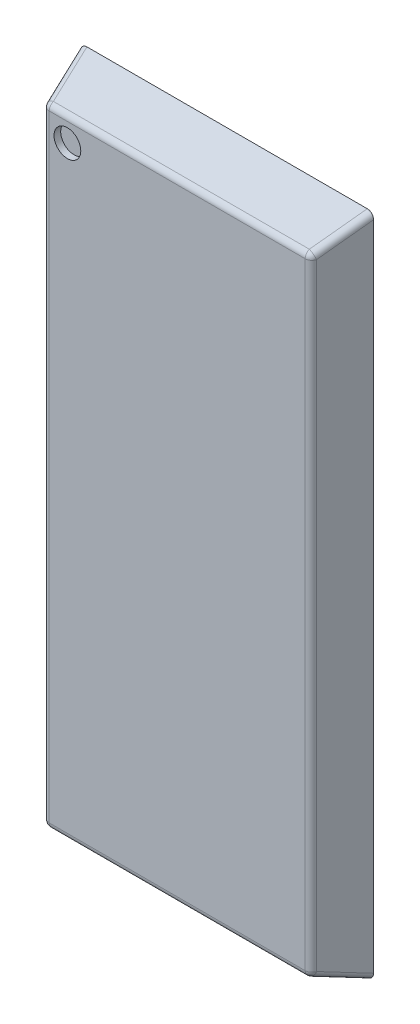
ISO-10303-21;
HEADER;
FILE_DESCRIPTION(('STEP AP214'),'2;1');
FILE_NAME('part.step','',(''),(''),'','','');
FILE_SCHEMA(('AUTOMOTIVE_DESIGN { 1 0 10303 214 1 1 1 1 }'));
ENDSEC;
DATA;
#1=APPLICATION_CONTEXT('core data for automotive mechanical design processes');
#2=APPLICATION_PROTOCOL_DEFINITION('international standard','automotive_design',2000,#1);
#3=PRODUCT_CONTEXT('',#1,'mechanical');
#4=PRODUCT('Part','Part','',(#3));
#5=PRODUCT_RELATED_PRODUCT_CATEGORY('part','',(#4));
#6=PRODUCT_DEFINITION_FORMATION('','',#4);
#7=PRODUCT_DEFINITION_CONTEXT('part definition',#1,'design');
#8=PRODUCT_DEFINITION('design','',#6,#7);
#9=PRODUCT_DEFINITION_SHAPE('','',#8);
#10=(LENGTH_UNIT() NAMED_UNIT(*) SI_UNIT(.MILLI.,.METRE.));
#11=(NAMED_UNIT(*) PLANE_ANGLE_UNIT() SI_UNIT($,.RADIAN.));
#12=(NAMED_UNIT(*) SI_UNIT($,.STERADIAN.) SOLID_ANGLE_UNIT());
#13=UNCERTAINTY_MEASURE_WITH_UNIT(LENGTH_MEASURE(1.E-05),#10,'distance_accuracy_value','');
#14=(GEOMETRIC_REPRESENTATION_CONTEXT(3) GLOBAL_UNCERTAINTY_ASSIGNED_CONTEXT((#13)) GLOBAL_UNIT_ASSIGNED_CONTEXT((#10,
#11,#12)) REPRESENTATION_CONTEXT('',''));
#15=CARTESIAN_POINT('',(0.,0.,0.));
#16=DIRECTION('',(0.,0.,1.));
#17=DIRECTION('',(1.,0.,0.));
#18=AXIS2_PLACEMENT_3D('',#15,#16,#17);
#19=CARTESIAN_POINT('',(-1.852027903349,4.147972096651,1.5));
#20=DIRECTION('',(0.,0.,1.));
#21=DIRECTION('',(1.,0.,0.));
#22=AXIS2_PLACEMENT_3D('',#19,#20,#21);
#23=PLANE('',#22);
#24=CARTESIAN_POINT('',(-1.65,4.35,1.5));
#25=DIRECTION('',(0.,0.,1.));
#26=DIRECTION('',(1.,0.,0.));
#27=AXIS2_PLACEMENT_3D('',#24,#25,#26);
#28=CIRCLE('',#27,0.201027903349);
#29=CARTESIAN_POINT('',(-1.448972096651,4.35,1.5));
#30=VERTEX_POINT('',#29);
#31=EDGE_CURVE('E233',#30,#30,#28,.F.);
#32=ORIENTED_EDGE('',*,*,#31,.F.);
#33=EDGE_LOOP('',(#32));
#34=FACE_BOUND('',#33,.T.);
#35=ADVANCED_FACE('F16',(#34),#23,.T.);
#36=CARTESIAN_POINT('',(1.923172168692,-4.632296703857,1.49999999999999));
#37=DIRECTION('',(0.,0.928476690885278,-0.371390676354058));
#38=DIRECTION('',(0.,0.371390676354058,0.928476690885278));
#39=AXIS2_PLACEMENT_3D('',#36,#37,#38);
#40=SPHERICAL_SURFACE('',#39,0.100000000000005);
#41=CARTESIAN_POINT('',(1.92317216970682,-4.63229670538072,1.4999999961896));
#42=DIRECTION('',(0.240336707250859,-0.360505060875346,-0.901262652189182));
#43=DIRECTION('',(0.,0.928476690885376,-0.371390676353814));
#44=AXIS2_PLACEMENT_3D('',#41,#42,#43);
#45=CIRCLE('',#44,0.100000000001136);
#46=CARTESIAN_POINT('',(2.01980320110445,-4.63220948359481,1.52573767014431));
#47=VERTEX_POINT('',#46);
#48=CARTESIAN_POINT('',(1.92317220109864,-4.72514437370805,1.53713906573047));
#49=VERTEX_POINT('',#48);
#50=EDGE_CURVE('E141',#47,#49,#45,.T.);
#51=ORIENTED_EDGE('',*,*,#50,.F.);
#52=CARTESIAN_POINT('',(1.92317216869162,-4.63229671558303,1.49999999999949));
#53=DIRECTION('',(0.,-1.,0.));
#54=DIRECTION('',(0.,0.,-1.));
#55=AXIS2_PLACEMENT_3D('',#52,#53,#54);
#56=CIRCLE('',#55,0.100000000000497);
#57=CARTESIAN_POINT('',(1.92317218325048,-4.63229670971982,1.6));
#58=VERTEX_POINT('',#57);
#59=EDGE_CURVE('E76',#58,#47,#56,.F.);
#60=ORIENTED_EDGE('',*,*,#59,.F.);
#61=CARTESIAN_POINT('',(1.92317219780934,-4.63229670385662,1.49999999999956));
#62=DIRECTION('',(-1.,0.,0.));
#63=DIRECTION('',(0.,0.,1.));
#64=AXIS2_PLACEMENT_3D('',#61,#62,#63);
#65=CIRCLE('',#64,0.100000000000631);
#66=EDGE_CURVE('E113',#49,#58,#65,.T.);
#67=ORIENTED_EDGE('',*,*,#66,.F.);
#68=EDGE_LOOP('',(#51,#60,#67));
#69=FACE_BOUND('',#68,.T.);
#70=ADVANCED_FACE('F318',(#69),#40,.T.);
#71=CARTESIAN_POINT('',(-1.923172168692,-4.63229670385701,1.5));
#72=DIRECTION('',(1.13715795844639E-13,0.928476690885211,-0.371390676354226));
#73=DIRECTION('',(-0.97068959353077,0.0892587969285736,0.223146992321052));
#74=AXIS2_PLACEMENT_3D('',#71,#72,#73);
#75=SPHERICAL_SURFACE('',#74,0.099999999999999);
#76=CARTESIAN_POINT('',(-1.92317216869162,-4.63229671558497,1.49999999999949));
#77=DIRECTION('',(0.,1.,0.));
#78=DIRECTION('',(0.,0.,1.));
#79=AXIS2_PLACEMENT_3D('',#76,#77,#78);
#80=CIRCLE('',#79,0.100000000000497);
#81=CARTESIAN_POINT('',(-2.01980329544704,-4.63220949910166,1.52573764207523));
#82=VERTEX_POINT('',#81);
#83=CARTESIAN_POINT('',(-1.92317218325048,-4.6322967097208,1.6));
#84=VERTEX_POINT('',#83);
#85=EDGE_CURVE('E126',#82,#84,#80,.T.);
#86=ORIENTED_EDGE('',*,*,#85,.F.);
#87=CARTESIAN_POINT('',(-1.9231721686913,-4.63229670385449,1.49999999999863));
#88=DIRECTION('',(-0.240336707248985,-0.36050506087696,-0.901262652189036));
#89=DIRECTION('',(0.,0.928476690884781,-0.371390676355299));
#90=AXIS2_PLACEMENT_3D('',#87,#88,#89);
#91=CIRCLE('',#90,0.100000000002628);
#92=CARTESIAN_POINT('',(-1.92317218325082,-4.72514437294551,1.53713906763542));
#93=VERTEX_POINT('',#92);
#94=EDGE_CURVE('E124',#93,#82,#91,.T.);
#95=ORIENTED_EDGE('',*,*,#94,.F.);
#96=CARTESIAN_POINT('',(-1.92317219780933,-4.63229670385662,1.49999999999956));
#97=DIRECTION('',(1.,0.,0.));
#98=DIRECTION('',(0.,0.,-1.));
#99=AXIS2_PLACEMENT_3D('',#96,#97,#98);
#100=CIRCLE('',#99,0.100000000000631);
#101=EDGE_CURVE('E84',#84,#93,#100,.T.);
#102=ORIENTED_EDGE('',*,*,#101,.F.);
#103=EDGE_LOOP('',(#86,#95,#102));
#104=FACE_BOUND('',#103,.T.);
#105=ADVANCED_FACE('F125',(#104),#75,.T.);
#106=CARTESIAN_POINT('',(-1.92317216869162,-4.63229671558303,1.49999999999949));
#107=DIRECTION('',(0.,1.,0.));
#108=DIRECTION('',(0.,0.,1.));
#109=AXIS2_PLACEMENT_3D('',#106,#107,#108);
#110=CYLINDRICAL_SURFACE('',#109,0.100000000000497);
#111=DIRECTION('',(0.,-1.,0.));
#112=VECTOR('',#111,1.);
#113=CARTESIAN_POINT('',(-1.923172168692,4.632296703857,1.6));
#114=LINE('',#113,#112);
#115=CARTESIAN_POINT('',(-1.92317218325048,4.63229670385767,1.60000000000001));
#116=VERTEX_POINT('',#115);
#117=EDGE_CURVE('E246',#116,#84,#114,.T.);
#118=ORIENTED_EDGE('',*,*,#117,.F.);
#119=CARTESIAN_POINT('',(-1.92317216869162,4.63229670385847,1.49999999999949));
#120=DIRECTION('',(0.,1.,0.));
#121=DIRECTION('',(0.,0.,1.));
#122=AXIS2_PLACEMENT_3D('',#119,#120,#121);
#123=CIRCLE('',#122,0.100000000000497);
#124=CARTESIAN_POINT('',(-2.01980520425165,4.63215335761909,1.52573048405632));
#125=VERTEX_POINT('',#124);
#126=EDGE_CURVE('E251',#125,#116,#123,.T.);
#127=ORIENTED_EDGE('',*,*,#126,.F.);
#128=DIRECTION('',(0.,1.,0.));
#129=VECTOR('',#128,1.);
#130=CARTESIAN_POINT('',(-2.0197956626518,-2.43196683247411E-05,1.52576626505575));
#131=LINE('',#130,#129);
#132=EDGE_CURVE('E249',#82,#125,#131,.T.);
#133=ORIENTED_EDGE('',*,*,#132,.F.);
#134=ORIENTED_EDGE('',*,*,#85,.T.);
#135=EDGE_LOOP('',(#118,#127,#133,#134));
#136=FACE_BOUND('',#135,.T.);
#137=ADVANCED_FACE('F244',(#136),#110,.T.);
#138=CARTESIAN_POINT('',(1.92317219780934,-4.63229670385662,1.49999999999956));
#139=DIRECTION('',(-1.,0.,0.));
#140=DIRECTION('',(0.,0.,1.));
#141=AXIS2_PLACEMENT_3D('',#138,#139,#140);
#142=CYLINDRICAL_SURFACE('',#141,0.100000000000631);
#143=ORIENTED_EDGE('',*,*,#101,.T.);
#144=DIRECTION('',(-1.,0.,0.));
#145=VECTOR('',#144,1.);
#146=CARTESIAN_POINT('',(1.80411241501588E-13,-4.7251443729458,1.5371390676355));
#147=LINE('',#146,#145);
#148=EDGE_CURVE('E107',#49,#93,#147,.T.);
#149=ORIENTED_EDGE('',*,*,#148,.F.);
#150=ORIENTED_EDGE('',*,*,#66,.T.);
#151=DIRECTION('',(1.,0.,0.));
#152=VECTOR('',#151,1.);
#153=CARTESIAN_POINT('',(-1.923172168692,-4.632296703857,1.6));
#154=LINE('',#153,#152);
#155=EDGE_CURVE('E110',#84,#58,#154,.T.);
#156=ORIENTED_EDGE('',*,*,#155,.F.);
#157=EDGE_LOOP('',(#143,#149,#150,#156));
#158=FACE_BOUND('',#157,.T.);
#159=ADVANCED_FACE('F106',(#158),#142,.T.);
#160=CARTESIAN_POINT('',(1.92317216869162,4.632296703857,1.49999999999949));
#161=DIRECTION('',(0.,-1.,0.));
#162=DIRECTION('',(0.,0.,-1.));
#163=AXIS2_PLACEMENT_3D('',#160,#161,#162);
#164=CYLINDRICAL_SURFACE('',#163,0.100000000000497);
#165=ORIENTED_EDGE('',*,*,#59,.T.);
#166=DIRECTION('',(0.,-1.,0.));
#167=VECTOR('',#166,1.);
#168=CARTESIAN_POINT('',(2.0197956626518,-2.43196682605563E-05,1.52576626505575));
#169=LINE('',#168,#167);
#170=CARTESIAN_POINT('',(2.01980331244744,4.63220934691891,1.52573757832374));
#171=VERTEX_POINT('',#170);
#172=EDGE_CURVE('E147',#171,#47,#169,.T.);
#173=ORIENTED_EDGE('',*,*,#172,.F.);
#174=CARTESIAN_POINT('',(1.92317216869162,4.632296703857,1.49999999999949));
#175=DIRECTION('',(0.,-1.,0.));
#176=DIRECTION('',(0.,0.,-1.));
#177=AXIS2_PLACEMENT_3D('',#174,#175,#176);
#178=CIRCLE('',#177,0.100000000000497);
#179=CARTESIAN_POINT('',(1.92317220059121,4.63229670385694,1.60000000000001));
#180=VERTEX_POINT('',#179);
#181=EDGE_CURVE('E112',#171,#180,#178,.T.);
#182=ORIENTED_EDGE('',*,*,#181,.T.);
#183=DIRECTION('',(0.,1.,0.));
#184=VECTOR('',#183,1.);
#185=CARTESIAN_POINT('',(1.923172168692,-4.632296703857,1.6));
#186=LINE('',#185,#184);
#187=EDGE_CURVE('E268',#58,#180,#186,.T.);
#188=ORIENTED_EDGE('',*,*,#187,.F.);
#189=EDGE_LOOP('',(#165,#173,#182,#188));
#190=FACE_BOUND('',#189,.T.);
#191=ADVANCED_FACE('F226',(#190),#164,.T.);
#192=CARTESIAN_POINT('',(-1.65,4.35,1.5));
#193=DIRECTION('',(0.,0.,1.));
#194=DIRECTION('',(1.,0.,0.));
#195=AXIS2_PLACEMENT_3D('',#192,#193,#194);
#196=CYLINDRICAL_SURFACE('',#195,0.201027903349);
#197=CARTESIAN_POINT('',(-1.65,4.35,1.6));
#198=DIRECTION('',(0.,0.,1.));
#199=DIRECTION('',(1.,0.,0.));
#200=AXIS2_PLACEMENT_3D('',#197,#198,#199);
#201=CIRCLE('',#200,0.201027903349);
#202=CARTESIAN_POINT('',(-1.448972096651,4.35,1.6));
#203=VERTEX_POINT('',#202);
#204=EDGE_CURVE('E270',#203,#203,#201,.F.);
#205=ORIENTED_EDGE('',*,*,#204,.F.);
#206=EDGE_LOOP('',(#205));
#207=FACE_BOUND('',#206,.T.);
#208=ORIENTED_EDGE('',*,*,#31,.T.);
#209=EDGE_LOOP('',(#208));
#210=FACE_BOUND('',#209,.T.);
#211=ADVANCED_FACE('F334',(#207,#210),#196,.F.);
#212=CARTESIAN_POINT('',(2.0172190361462,-4.91297629059303,1.53542861445176));
#213=DIRECTION('',(0.966234939601248,0.,0.257662650560325));
#214=DIRECTION('',(0.257662650560325,0.,-0.966234939601248));
#215=AXIS2_PLACEMENT_3D('',#212,#213,#214);
#216=PLANE('',#215);
#217=ORIENTED_EDGE('',*,*,#172,.T.);
#218=CARTESIAN_POINT('',(2.19999927514701,-4.90297628862434,0.850000365623384));
#219=CARTESIAN_POINT('',(2.19249163633334,-4.89169002007222,0.878154322435761));
#220=CARTESIAN_POINT('',(2.18498398983271,-4.88040375149425,0.906308277187943));
#221=CARTESIAN_POINT('',(2.16996868145647,-4.85783121429687,0.962616182575739));
#222=CARTESIAN_POINT('',(2.16246101958086,-4.84654494567747,0.990770133211354));
#223=CARTESIAN_POINT('',(2.14744568045361,-4.82397240840749,1.04707803036984));
#224=CARTESIAN_POINT('',(2.13993800320198,-4.81268613975691,1.07523197689271));
#225=CARTESIAN_POINT('',(2.12492263332164,-4.79011360243484,1.13153986582954));
#226=CARTESIAN_POINT('',(2.11741494069295,-4.77882733376335,1.15969380824349));
#227=CARTESIAN_POINT('',(2.10239954005745,-4.7562547964097,1.21600168896631));
#228=CARTESIAN_POINT('',(2.09489183205065,-4.74496852772755,1.24415562727518));
#229=CARTESIAN_POINT('',(2.07987640065793,-4.72239599036285,1.30046349979165));
#230=CARTESIAN_POINT('',(2.07236867727201,-4.7111097216803,1.32861743399925));
#231=CARTESIAN_POINT('',(2.05735321512003,-4.68853718432506,1.38492529831704));
#232=CARTESIAN_POINT('',(2.04984547635396,-4.67725091565237,1.41307922842722));
#233=CARTESIAN_POINT('',(2.03482998344068,-4.65467837832712,1.46938708455399));
#234=CARTESIAN_POINT('',(2.02732222929347,-4.64339210967455,1.49754101057057));
#235=CARTESIAN_POINT('',(2.01981446745517,-4.63210584103717,1.52569493454228));
#236=B_SPLINE_CURVE_WITH_KNOTS('',3,(#218,#219,#220,#221,#222,#223,#224,#225,#226,#227,#228,
#229,#230,#231,#232,#233,#234,#235),.UNSPECIFIED.,.F.,.F.,(4,2,2,2,2,2,2,2,4),(0.,
0.0937417091972572,0.187483418394514,0.281225127591771,0.374966836789028,0.468708545986285,
0.562450255183542,0.656191964380799,0.749933673578056),.UNSPECIFIED.);
#237=CARTESIAN_POINT('',(2.19999932494818,-4.90297604879559,0.850000182811692));
#238=VERTEX_POINT('',#237);
#239=EDGE_CURVE('E144',#238,#47,#236,.T.);
#240=ORIENTED_EDGE('',*,*,#239,.F.);
#241=DIRECTION('',(0.,-1.,0.));
#242=VECTOR('',#241,1.);
#243=CARTESIAN_POINT('',(2.2,4.90292735235875,0.85));
#244=LINE('',#243,#242);
#245=CARTESIAN_POINT('',(2.19998362372727,4.90292757220578,0.850060819541324));
#246=VERTEX_POINT('',#245);
#247=EDGE_CURVE('E231',#246,#238,#244,.T.);
#248=ORIENTED_EDGE('',*,*,#247,.F.);
#249=DIRECTION('',(-0.240268135658459,-0.361192879559912,0.901005508719246));
#250=VECTOR('',#249,1.);
#251=CARTESIAN_POINT('',(2.19996756244836,4.90292765125651,0.850121640818636));
#252=LINE('',#251,#250);
#253=EDGE_CURVE('E150',#246,#171,#252,.T.);
#254=ORIENTED_EDGE('',*,*,#253,.T.);
#255=EDGE_LOOP('',(#217,#240,#248,#254));
#256=FACE_BOUND('',#255,.T.);
#257=ADVANCED_FACE('F176',(#256),#216,.T.);
#258=CARTESIAN_POINT('',(1.92317216869083,-4.63229670385673,1.49999999999957));
#259=DIRECTION('',(0.240336707250859,-0.360505060875342,-0.901262652189184));
#260=DIRECTION('',(0.,0.928476690885377,-0.371390676353809));
#261=AXIS2_PLACEMENT_3D('',#258,#259,#260);
#262=CYLINDRICAL_SURFACE('',#261,0.100000000001136);
#263=ORIENTED_EDGE('',*,*,#50,.T.);
#264=DIRECTION('',(-0.240336628404482,0.360505068125865,0.901262670314671));
#265=VECTOR('',#264,1.);
#266=CARTESIAN_POINT('',(2.10640925339436,-4.99999999999997,0.850000000000081));
#267=LINE('',#266,#265);
#268=CARTESIAN_POINT('',(2.10640925339414,-5.00000000000011,0.85));
#269=VERTEX_POINT('',#268);
#270=EDGE_CURVE('E121',#269,#49,#267,.T.);
#271=ORIENTED_EDGE('',*,*,#270,.F.);
#272=CARTESIAN_POINT('',(2.09650550202434,-4.89229670385632,0.85));
#273=DIRECTION('',(0.,0.,-1.));
#274=DIRECTION('',(0.554700196226237,-0.832050294337172,0.));
#275=AXIS2_PLACEMENT_3D('',#272,#273,#274);
#276=ELLIPSE('',#275,0.110955446515213,0.100000000001136);
#277=EDGE_CURVE('E276',#238,#269,#276,.T.);
#278=ORIENTED_EDGE('',*,*,#277,.F.);
#279=ORIENTED_EDGE('',*,*,#239,.T.);
#280=EDGE_LOOP('',(#263,#271,#278,#279));
#281=FACE_BOUND('',#280,.T.);
#282=ADVANCED_FACE('F166',(#281),#262,.T.);
#283=CARTESIAN_POINT('',(-2.116409253394,-4.72143046065462,1.54642384836345));
#284=DIRECTION('',(0.,-0.92847669088526,0.371390676354102));
#285=DIRECTION('',(0.,-0.371390676354102,-0.92847669088526));
#286=AXIS2_PLACEMENT_3D('',#283,#284,#285);
#287=PLANE('',#286);
#288=ORIENTED_EDGE('',*,*,#148,.T.);
#289=DIRECTION('',(0.240336707249051,0.360505060877006,0.901262652189));
#290=VECTOR('',#289,1.);
#291=CARTESIAN_POINT('',(-2.01625007438956,-4.8647612314925,1.18809692126874));
#292=LINE('',#291,#290);
#293=CARTESIAN_POINT('',(-2.10640925339348,-5.00000000000051,0.85));
#294=VERTEX_POINT('',#293);
#295=EDGE_CURVE('E119',#294,#93,#292,.T.);
#296=ORIENTED_EDGE('',*,*,#295,.F.);
#297=DIRECTION('',(-1.,0.,0.));
#298=VECTOR('',#297,1.);
#299=CARTESIAN_POINT('',(2.106409253394,-5.,0.85));
#300=LINE('',#299,#298);
#301=EDGE_CURVE('E279',#269,#294,#300,.T.);
#302=ORIENTED_EDGE('',*,*,#301,.F.);
#303=ORIENTED_EDGE('',*,*,#270,.T.);
#304=EDGE_LOOP('',(#288,#296,#302,#303));
#305=FACE_BOUND('',#304,.T.);
#306=ADVANCED_FACE('F116',(#305),#287,.T.);
#307=CARTESIAN_POINT('',(-1.9231721686913,-4.63229670385449,1.49999999999863));
#308=DIRECTION('',(-0.240336707248985,-0.36050506087696,-0.901262652189036));
#309=DIRECTION('',(0.,0.928476690884781,-0.371390676355299));
#310=AXIS2_PLACEMENT_3D('',#307,#308,#309);
#311=CYLINDRICAL_SURFACE('',#310,0.100000000002628);
#312=ORIENTED_EDGE('',*,*,#94,.T.);
#313=DIRECTION('',(0.240268169327023,0.361192542211328,0.901005634976363));
#314=VECTOR('',#313,1.);
#315=CARTESIAN_POINT('',(-2.19999992626896,-4.90297638923075,0.850000276491396));
#316=LINE('',#315,#314);
#317=CARTESIAN_POINT('',(-2.2,-4.90297607526901,0.85));
#318=VERTEX_POINT('',#317);
#319=EDGE_CURVE('E129',#318,#82,#316,.T.);
#320=ORIENTED_EDGE('',*,*,#319,.F.);
#321=CARTESIAN_POINT('',(-2.09650550202324,-4.89229670385491,0.85));
#322=DIRECTION('',(0.,0.,-1.));
#323=DIRECTION('',(-0.554700196221519,-0.832050294340317,0.));
#324=AXIS2_PLACEMENT_3D('',#321,#322,#323);
#325=ELLIPSE('',#324,0.110955446516886,0.100000000002628);
#326=EDGE_CURVE('E133',#294,#318,#325,.T.);
#327=ORIENTED_EDGE('',*,*,#326,.F.);
#328=ORIENTED_EDGE('',*,*,#295,.T.);
#329=EDGE_LOOP('',(#312,#320,#327,#328));
#330=FACE_BOUND('',#329,.T.);
#331=ADVANCED_FACE('F131',(#330),#311,.T.);
#332=CARTESIAN_POINT('',(-2.2025766265056,-4.91297629059315,0.840337650603988));
#333=DIRECTION('',(-0.966234939601248,0.,0.257662650560325));
#334=DIRECTION('',(0.257662650560325,0.,0.966234939601248));
#335=AXIS2_PLACEMENT_3D('',#332,#333,#334);
#336=PLANE('',#335);
#337=ORIENTED_EDGE('',*,*,#132,.T.);
#338=DIRECTION('',(-0.240268135658523,0.361192879559267,-0.901005508719487));
#339=VECTOR('',#338,1.);
#340=CARTESIAN_POINT('',(-2.0198147458515,4.63210557820471,1.52569470305688));
#341=LINE('',#340,#339);
#342=CARTESIAN_POINT('',(-2.1999833312916,4.90292756588826,0.850060741186204));
#343=VERTEX_POINT('',#342);
#344=EDGE_CURVE('E93',#125,#343,#341,.T.);
#345=ORIENTED_EDGE('',*,*,#344,.T.);
#346=DIRECTION('',(0.,1.,0.));
#347=VECTOR('',#346,1.);
#348=CARTESIAN_POINT('',(-2.2,-4.90297565046819,0.85));
#349=LINE('',#348,#347);
#350=EDGE_CURVE('E255',#318,#343,#349,.T.);
#351=ORIENTED_EDGE('',*,*,#350,.F.);
#352=ORIENTED_EDGE('',*,*,#319,.T.);
#353=EDGE_LOOP('',(#337,#345,#351,#352));
#354=FACE_BOUND('',#353,.T.);
#355=ADVANCED_FACE('F183',(#354),#336,.T.);
#356=CARTESIAN_POINT('',(-1.923172168692,4.632296703857,1.5));
#357=DIRECTION('',(0.,-0.928476690885273,-0.371390676354069));
#358=DIRECTION('',(0.,-0.371390676354069,0.928476690885273));
#359=AXIS2_PLACEMENT_3D('',#356,#357,#358);
#360=SPHERICAL_SURFACE('',#359,0.100000000000005);
#361=CARTESIAN_POINT('',(-1.92317216970723,4.63229670537837,1.49999999618896));
#362=DIRECTION('',(-0.240336707249056,0.360505060876991,-0.901262652189005));
#363=DIRECTION('',(0.,0.928476690884766,0.371390676355338));
#364=AXIS2_PLACEMENT_3D('',#361,#362,#363);
#365=CIRCLE('',#364,0.100000000002619);
#366=CARTESIAN_POINT('',(-1.92317220109927,4.72514437370749,1.5371390657306));
#367=VERTEX_POINT('',#366);
#368=EDGE_CURVE('E289',#125,#367,#365,.T.);
#369=ORIENTED_EDGE('',*,*,#368,.F.);
#370=ORIENTED_EDGE('',*,*,#126,.T.);
#371=CARTESIAN_POINT('',(-1.92317219780933,4.63229670385688,1.49999999999938));
#372=DIRECTION('',(1.,0.,0.));
#373=DIRECTION('',(0.,0.,-1.));
#374=AXIS2_PLACEMENT_3D('',#371,#372,#373);
#375=CIRCLE('',#374,0.100000000000636);
#376=EDGE_CURVE('E304',#367,#116,#375,.T.);
#377=ORIENTED_EDGE('',*,*,#376,.F.);
#378=EDGE_LOOP('',(#369,#370,#377));
#379=FACE_BOUND('',#378,.T.);
#380=ADVANCED_FACE('F186',(#379),#360,.T.);
#381=CARTESIAN_POINT('',(-5.26243627528907,3.21242002809724,1.6));
#382=DIRECTION('',(0.,0.,1.));
#383=DIRECTION('',(0.391555164096889,-0.92015463562874,0.));
#384=AXIS2_PLACEMENT_3D('',#381,#382,#383);
#385=PLANE('',#384);
#386=ORIENTED_EDGE('',*,*,#204,.T.);
#387=EDGE_LOOP('',(#386));
#388=FACE_BOUND('',#387,.T.);
#389=ORIENTED_EDGE('',*,*,#187,.T.);
#390=DIRECTION('',(1.,0.,0.));
#391=VECTOR('',#390,1.);
#392=CARTESIAN_POINT('',(1.73407350761642E-08,4.632296703857,1.60000000000003));
#393=LINE('',#392,#391);
#394=EDGE_CURVE('E303',#116,#180,#393,.T.);
#395=ORIENTED_EDGE('',*,*,#394,.F.);
#396=ORIENTED_EDGE('',*,*,#117,.T.);
#397=ORIENTED_EDGE('',*,*,#155,.T.);
#398=EDGE_LOOP('',(#389,#395,#396,#397));
#399=FACE_BOUND('',#398,.T.);
#400=ADVANCED_FACE('F190',(#388,#399),#385,.T.);
#401=CARTESIAN_POINT('',(1.923172168692,4.63229670385699,1.50000000000001));
#402=DIRECTION('',(0.,0.,1.));
#403=DIRECTION('',(-1.,3.24013856129054E-11,0.));
#404=AXIS2_PLACEMENT_3D('',#401,#402,#403);
#405=SPHERICAL_SURFACE('',#404,0.0999999999999942);
#406=CARTESIAN_POINT('',(1.92317216869124,4.63229670385438,1.49999999999891));
#407=DIRECTION('',(0.240336707249004,0.360505060876974,-0.901262652189025));
#408=DIRECTION('',(0.,0.928476690884775,0.371390676355315));
#409=AXIS2_PLACEMENT_3D('',#406,#407,#408);
#410=CIRCLE('',#409,0.100000000002618);
#411=CARTESIAN_POINT('',(1.92317220059102,4.72514437001209,1.53713907496874));
#412=VERTEX_POINT('',#411);
#413=EDGE_CURVE('E35',#412,#171,#410,.T.);
#414=ORIENTED_EDGE('',*,*,#413,.F.);
#415=CARTESIAN_POINT('',(1.9231722324908,4.63229670385688,1.49999999999938));
#416=DIRECTION('',(-1.,0.,0.));
#417=DIRECTION('',(0.,0.,1.));
#418=AXIS2_PLACEMENT_3D('',#415,#416,#417);
#419=CIRCLE('',#418,0.100000000000636);
#420=EDGE_CURVE('E293',#180,#412,#419,.T.);
#421=ORIENTED_EDGE('',*,*,#420,.F.);
#422=ORIENTED_EDGE('',*,*,#181,.F.);
#423=EDGE_LOOP('',(#414,#421,#422));
#424=FACE_BOUND('',#423,.T.);
#425=ADVANCED_FACE('F194',(#424),#405,.T.);
#426=CARTESIAN_POINT('',(-1.48661929242461,-6.623061495193,0.85));
#427=DIRECTION('',(0.,0.,-1.));
#428=DIRECTION('',(-0.402738614265916,0.91531503242281,0.));
#429=AXIS2_PLACEMENT_3D('',#426,#427,#428);
#430=PLANE('',#429);
#431=ORIENTED_EDGE('',*,*,#350,.T.);
#432=CARTESIAN_POINT('',(-2.09650550202331,4.89229670385496,0.85));
#433=DIRECTION('',(0.,0.,-1.));
#434=DIRECTION('',(0.55470019622159,-0.83205029434027,0.));
#435=AXIS2_PLACEMENT_3D('',#432,#433,#434);
#436=ELLIPSE('',#435,0.110955446516877,0.100000000002615);
#437=CARTESIAN_POINT('',(-2.10640925339369,5.00000000000026,0.85));
#438=VERTEX_POINT('',#437);
#439=EDGE_CURVE('E285',#438,#343,#436,.F.);
#440=ORIENTED_EDGE('',*,*,#439,.F.);
#441=DIRECTION('',(-1.,0.,0.));
#442=VECTOR('',#441,1.);
#443=CARTESIAN_POINT('',(-1.79977560632594E-13,5.,0.85));
#444=LINE('',#443,#442);
#445=CARTESIAN_POINT('',(2.10640925339347,5.00000000000025,0.85));
#446=VERTEX_POINT('',#445);
#447=EDGE_CURVE('E222',#446,#438,#444,.T.);
#448=ORIENTED_EDGE('',*,*,#447,.F.);
#449=CARTESIAN_POINT('',(2.09650550202327,4.89229670385493,0.85));
#450=DIRECTION('',(0.,0.,-1.));
#451=DIRECTION('',(0.554700196221536,0.832050294340306,0.));
#452=AXIS2_PLACEMENT_3D('',#449,#450,#451);
#453=ELLIPSE('',#452,0.110955446516877,0.100000000002618);
#454=EDGE_CURVE('E223',#246,#446,#453,.F.);
#455=ORIENTED_EDGE('',*,*,#454,.F.);
#456=ORIENTED_EDGE('',*,*,#247,.T.);
#457=ORIENTED_EDGE('',*,*,#277,.T.);
#458=ORIENTED_EDGE('',*,*,#301,.T.);
#459=ORIENTED_EDGE('',*,*,#326,.T.);
#460=EDGE_LOOP('',(#431,#440,#448,#455,#456,#457,#458,#459));
#461=FACE_BOUND('',#460,.T.);
#462=ADVANCED_FACE('F198',(#461),#430,.T.);
#463=CARTESIAN_POINT('',(-2.10932887335376,4.91153176085082,0.801912357510548));
#464=DIRECTION('',(0.24033670724906,-0.360505060877007,0.901262652188997));
#465=DIRECTION('',(0.,-0.928476690884759,-0.371390676355354));
#466=AXIS2_PLACEMENT_3D('',#463,#464,#465);
#467=CYLINDRICAL_SURFACE('',#466,0.100000000002615);
#468=ORIENTED_EDGE('',*,*,#368,.T.);
#469=DIRECTION('',(0.240336628404482,-0.360505068125866,0.901262670314671));
#470=VECTOR('',#469,1.);
#471=CARTESIAN_POINT('',(-2.10640925339436,4.99999999999997,0.85000000000008));
#472=LINE('',#471,#470);
#473=EDGE_CURVE('E295',#438,#367,#472,.T.);
#474=ORIENTED_EDGE('',*,*,#473,.F.);
#475=ORIENTED_EDGE('',*,*,#439,.T.);
#476=ORIENTED_EDGE('',*,*,#344,.F.);
#477=EDGE_LOOP('',(#468,#474,#475,#476));
#478=FACE_BOUND('',#477,.T.);
#479=ADVANCED_FACE('F201',(#478),#467,.T.);
#480=CARTESIAN_POINT('',(-1.92317219780933,4.63229670385688,1.49999999999938));
#481=DIRECTION('',(1.,0.,0.));
#482=DIRECTION('',(0.,0.,-1.));
#483=AXIS2_PLACEMENT_3D('',#480,#481,#482);
#484=CYLINDRICAL_SURFACE('',#483,0.100000000000636);
#485=ORIENTED_EDGE('',*,*,#420,.T.);
#486=DIRECTION('',(1.,0.,0.));
#487=VECTOR('',#486,1.);
#488=CARTESIAN_POINT('',(-1.79977560632594E-13,4.7251443729458,1.5371390676355));
#489=LINE('',#488,#487);
#490=EDGE_CURVE('E26',#367,#412,#489,.T.);
#491=ORIENTED_EDGE('',*,*,#490,.F.);
#492=ORIENTED_EDGE('',*,*,#376,.T.);
#493=ORIENTED_EDGE('',*,*,#394,.T.);
#494=EDGE_LOOP('',(#485,#491,#492,#493));
#495=FACE_BOUND('',#494,.T.);
#496=ADVANCED_FACE('F205',(#495),#484,.T.);
#497=CARTESIAN_POINT('',(1.92317216869124,4.63229670385438,1.49999999999891));
#498=DIRECTION('',(0.240336707249004,0.360505060876974,-0.901262652189025));
#499=DIRECTION('',(0.,0.928476690884775,0.371390676355315));
#500=AXIS2_PLACEMENT_3D('',#497,#498,#499);
#501=CYLINDRICAL_SURFACE('',#500,0.100000000002618);
#502=ORIENTED_EDGE('',*,*,#413,.T.);
#503=ORIENTED_EDGE('',*,*,#253,.F.);
#504=ORIENTED_EDGE('',*,*,#454,.T.);
#505=DIRECTION('',(0.240336628404013,0.360505068125909,-0.901262670314778));
#506=VECTOR('',#505,1.);
#507=CARTESIAN_POINT('',(1.92317223249041,4.72514437294596,1.53713906763509));
#508=LINE('',#507,#506);
#509=EDGE_CURVE('E11',#412,#446,#508,.T.);
#510=ORIENTED_EDGE('',*,*,#509,.F.);
#511=EDGE_LOOP('',(#502,#503,#504,#510));
#512=FACE_BOUND('',#511,.T.);
#513=ADVANCED_FACE('F207',(#512),#501,.T.);
#514=CARTESIAN_POINT('',(-2.11640925339436,5.00371390676354,0.840715233091147));
#515=DIRECTION('',(0.,0.92847669088526,0.371390676354102));
#516=DIRECTION('',(0.,-0.371390676354102,0.92847669088526));
#517=AXIS2_PLACEMENT_3D('',#514,#515,#516);
#518=PLANE('',#517);
#519=ORIENTED_EDGE('',*,*,#490,.T.);
#520=ORIENTED_EDGE('',*,*,#509,.T.);
#521=ORIENTED_EDGE('',*,*,#447,.T.);
#522=ORIENTED_EDGE('',*,*,#473,.T.);
#523=EDGE_LOOP('',(#519,#520,#521,#522));
#524=FACE_BOUND('',#523,.T.);
#525=ADVANCED_FACE('F18',(#524),#518,.T.);
#526=CLOSED_SHELL('',(#35,#70,#105,#137,#159,#191,#211,#257,#282,#306,#331,#355,#380,#400,#425,
#462,#479,#496,#513,#525));
#527=MANIFOLD_SOLID_BREP('B1',#526);
#528=ADVANCED_BREP_SHAPE_REPRESENTATION('',(#18,#527),#14);
#529=SHAPE_DEFINITION_REPRESENTATION(#9,#528);
ENDSEC;
END-ISO-10303-21;
